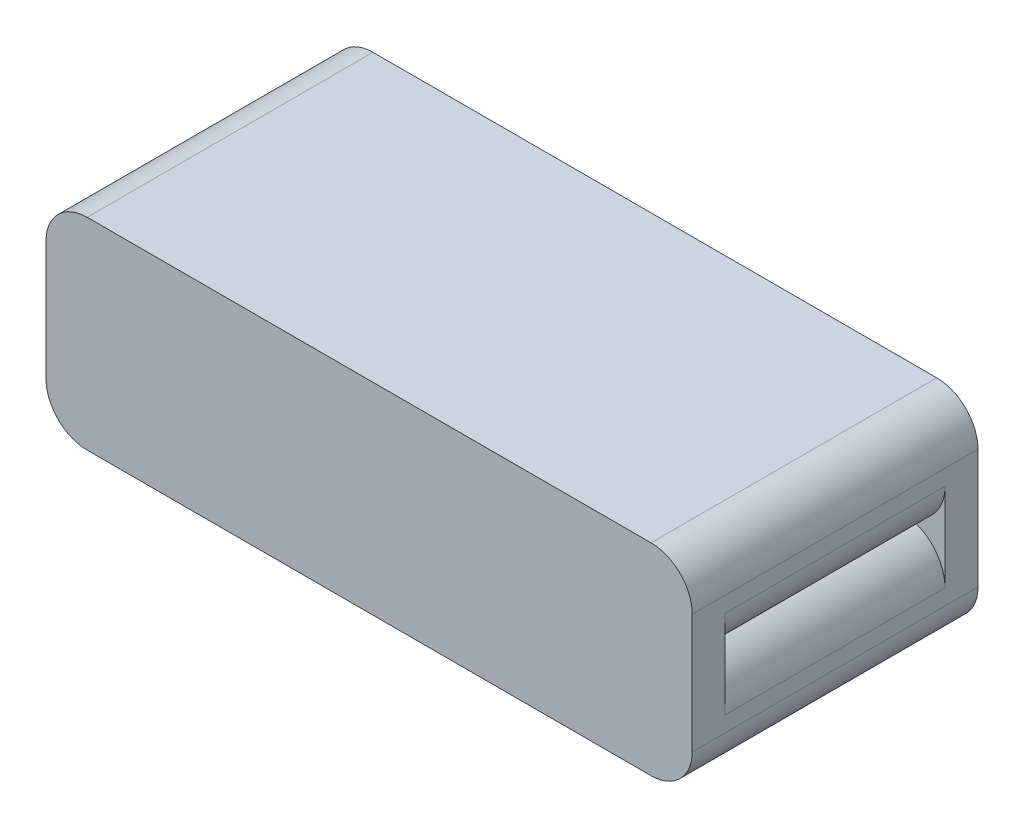
ISO-10303-21;
HEADER;
FILE_DESCRIPTION(('STEP AP214'),'2;1');
FILE_NAME('part.step','',(''),(''),'','','');
FILE_SCHEMA(('AUTOMOTIVE_DESIGN { 1 0 10303 214 1 1 1 1 }'));
ENDSEC;
DATA;
#1=APPLICATION_CONTEXT('core data for automotive mechanical design processes');
#2=APPLICATION_PROTOCOL_DEFINITION('international standard','automotive_design',2000,#1);
#3=PRODUCT_CONTEXT('',#1,'mechanical');
#4=PRODUCT('Part','Part','',(#3));
#5=PRODUCT_RELATED_PRODUCT_CATEGORY('part','',(#4));
#6=PRODUCT_DEFINITION_FORMATION('','',#4);
#7=PRODUCT_DEFINITION_CONTEXT('part definition',#1,'design');
#8=PRODUCT_DEFINITION('design','',#6,#7);
#9=PRODUCT_DEFINITION_SHAPE('','',#8);
#10=(LENGTH_UNIT() NAMED_UNIT(*) SI_UNIT(.MILLI.,.METRE.));
#11=(NAMED_UNIT(*) PLANE_ANGLE_UNIT() SI_UNIT($,.RADIAN.));
#12=(NAMED_UNIT(*) SI_UNIT($,.STERADIAN.) SOLID_ANGLE_UNIT());
#13=UNCERTAINTY_MEASURE_WITH_UNIT(LENGTH_MEASURE(1.E-05),#10,'distance_accuracy_value','');
#14=(GEOMETRIC_REPRESENTATION_CONTEXT(3) GLOBAL_UNCERTAINTY_ASSIGNED_CONTEXT((#13)) GLOBAL_UNIT_ASSIGNED_CONTEXT((#10,
#11,#12)) REPRESENTATION_CONTEXT('',''));
#15=CARTESIAN_POINT('',(0.,0.,0.));
#16=DIRECTION('',(0.,0.,1.));
#17=DIRECTION('',(1.,0.,0.));
#18=AXIS2_PLACEMENT_3D('',#15,#16,#17);
#19=CARTESIAN_POINT('',(74.676,23.3045,-33.02));
#20=DIRECTION('',(-1.,0.,0.));
#21=DIRECTION('',(0.,0.,1.));
#22=AXIS2_PLACEMENT_3D('',#19,#20,#21);
#23=PLANE('',#22);
#24=DIRECTION('',(0.,-1.,0.));
#25=VECTOR('',#24,1.);
#26=CARTESIAN_POINT('',(74.676,23.3045,-33.02));
#27=LINE('',#26,#25);
#28=CARTESIAN_POINT('',(74.676,13.7795,-33.02));
#29=VERTEX_POINT('',#28);
#30=CARTESIAN_POINT('',(74.676,-13.7795,-33.02));
#31=VERTEX_POINT('',#30);
#32=EDGE_CURVE('E201',#29,#31,#27,.T.);
#33=ORIENTED_EDGE('',*,*,#32,.F.);
#34=DIRECTION('',(0.,0.,-1.));
#35=VECTOR('',#34,1.);
#36=CARTESIAN_POINT('',(74.676,13.7795,33.02));
#37=LINE('',#36,#35);
#38=CARTESIAN_POINT('',(74.676,13.7795,33.02));
#39=VERTEX_POINT('',#38);
#40=EDGE_CURVE('E11',#29,#39,#37,.F.);
#41=ORIENTED_EDGE('',*,*,#40,.T.);
#42=DIRECTION('',(0.,-1.,0.));
#43=VECTOR('',#42,1.);
#44=CARTESIAN_POINT('',(74.676,23.3045,33.02));
#45=LINE('',#44,#43);
#46=CARTESIAN_POINT('',(74.676,-13.7795,33.02));
#47=VERTEX_POINT('',#46);
#48=EDGE_CURVE('E204',#39,#47,#45,.T.);
#49=ORIENTED_EDGE('',*,*,#48,.T.);
#50=DIRECTION('',(0.,0.,-1.));
#51=VECTOR('',#50,1.);
#52=CARTESIAN_POINT('',(74.676,-13.7795,-33.02));
#53=LINE('',#52,#51);
#54=EDGE_CURVE('E40',#47,#31,#53,.T.);
#55=ORIENTED_EDGE('',*,*,#54,.T.);
#56=EDGE_LOOP('',(#33,#41,#49,#55));
#57=FACE_BOUND('',#56,.T.);
#58=DIRECTION('',(0.,-1.,0.));
#59=VECTOR('',#58,1.);
#60=CARTESIAN_POINT('',(74.676,10.16,-25.4));
#61=LINE('',#60,#59);
#62=CARTESIAN_POINT('',(74.676,10.16,-25.4));
#63=VERTEX_POINT('',#62);
#64=CARTESIAN_POINT('',(74.676,-10.16,-25.4));
#65=VERTEX_POINT('',#64);
#66=EDGE_CURVE('E151',#63,#65,#61,.T.);
#67=ORIENTED_EDGE('',*,*,#66,.T.);
#68=DIRECTION('',(0.,0.,1.));
#69=VECTOR('',#68,1.);
#70=CARTESIAN_POINT('',(74.676,-10.16,-25.4));
#71=LINE('',#70,#69);
#72=CARTESIAN_POINT('',(74.676,-10.16,25.4));
#73=VERTEX_POINT('',#72);
#74=EDGE_CURVE('E135',#65,#73,#71,.T.);
#75=ORIENTED_EDGE('',*,*,#74,.T.);
#76=DIRECTION('',(0.,-1.,0.));
#77=VECTOR('',#76,1.);
#78=CARTESIAN_POINT('',(74.676,10.16,25.4));
#79=LINE('',#78,#77);
#80=CARTESIAN_POINT('',(74.676,10.16,25.4));
#81=VERTEX_POINT('',#80);
#82=EDGE_CURVE('E158',#81,#73,#79,.T.);
#83=ORIENTED_EDGE('',*,*,#82,.F.);
#84=DIRECTION('',(0.,0.,1.));
#85=VECTOR('',#84,1.);
#86=CARTESIAN_POINT('',(74.676,10.16,-25.4));
#87=LINE('',#86,#85);
#88=EDGE_CURVE('E47',#63,#81,#87,.T.);
#89=ORIENTED_EDGE('',*,*,#88,.F.);
#90=EDGE_LOOP('',(#67,#75,#83,#89));
#91=FACE_BOUND('',#90,.T.);
#92=ADVANCED_FACE('F32',(#57,#91),#23,.F.);
#93=CARTESIAN_POINT('',(-74.676,23.3045,-33.02));
#94=DIRECTION('',(1.,0.,0.));
#95=DIRECTION('',(0.,0.,-1.));
#96=AXIS2_PLACEMENT_3D('',#93,#94,#95);
#97=PLANE('',#96);
#98=DIRECTION('',(0.,-1.,0.));
#99=VECTOR('',#98,1.);
#100=CARTESIAN_POINT('',(-74.676,23.3045,-33.02));
#101=LINE('',#100,#99);
#102=CARTESIAN_POINT('',(-74.676,13.7795,-33.02));
#103=VERTEX_POINT('',#102);
#104=CARTESIAN_POINT('',(-74.676,-13.7795,-33.02));
#105=VERTEX_POINT('',#104);
#106=EDGE_CURVE('E194',#103,#105,#101,.T.);
#107=ORIENTED_EDGE('',*,*,#106,.T.);
#108=DIRECTION('',(0.,0.,1.));
#109=VECTOR('',#108,1.);
#110=CARTESIAN_POINT('',(-74.676,-13.7795,-33.02));
#111=LINE('',#110,#109);
#112=CARTESIAN_POINT('',(-74.676,-13.7795,33.02));
#113=VERTEX_POINT('',#112);
#114=EDGE_CURVE('E212',#105,#113,#111,.T.);
#115=ORIENTED_EDGE('',*,*,#114,.T.);
#116=DIRECTION('',(0.,-1.,0.));
#117=VECTOR('',#116,1.);
#118=CARTESIAN_POINT('',(-74.676,23.3045,33.02));
#119=LINE('',#118,#117);
#120=CARTESIAN_POINT('',(-74.676,13.7795,33.02));
#121=VERTEX_POINT('',#120);
#122=EDGE_CURVE('E207',#121,#113,#119,.T.);
#123=ORIENTED_EDGE('',*,*,#122,.F.);
#124=DIRECTION('',(0.,0.,1.));
#125=VECTOR('',#124,1.);
#126=CARTESIAN_POINT('',(-74.676,13.7795,-33.02));
#127=LINE('',#126,#125);
#128=EDGE_CURVE('E210',#121,#103,#127,.F.);
#129=ORIENTED_EDGE('',*,*,#128,.T.);
#130=EDGE_LOOP('',(#107,#115,#123,#129));
#131=FACE_BOUND('',#130,.T.);
#132=DIRECTION('',(0.,-1.,0.));
#133=VECTOR('',#132,1.);
#134=CARTESIAN_POINT('',(-74.676,10.16,-25.4));
#135=LINE('',#134,#133);
#136=CARTESIAN_POINT('',(-74.676,10.16,-25.4));
#137=VERTEX_POINT('',#136);
#138=CARTESIAN_POINT('',(-74.676,-10.16,-25.4));
#139=VERTEX_POINT('',#138);
#140=EDGE_CURVE('E171',#137,#139,#135,.T.);
#141=ORIENTED_EDGE('',*,*,#140,.F.);
#142=DIRECTION('',(0.,0.,1.));
#143=VECTOR('',#142,1.);
#144=CARTESIAN_POINT('',(-74.676,10.16,-25.4));
#145=LINE('',#144,#143);
#146=CARTESIAN_POINT('',(-74.676,10.16,25.4));
#147=VERTEX_POINT('',#146);
#148=EDGE_CURVE('E183',#137,#147,#145,.T.);
#149=ORIENTED_EDGE('',*,*,#148,.T.);
#150=DIRECTION('',(0.,-1.,0.));
#151=VECTOR('',#150,1.);
#152=CARTESIAN_POINT('',(-74.676,10.16,25.4));
#153=LINE('',#152,#151);
#154=CARTESIAN_POINT('',(-74.676,-10.16,25.4));
#155=VERTEX_POINT('',#154);
#156=EDGE_CURVE('E168',#147,#155,#153,.T.);
#157=ORIENTED_EDGE('',*,*,#156,.T.);
#158=DIRECTION('',(0.,0.,1.));
#159=VECTOR('',#158,1.);
#160=CARTESIAN_POINT('',(-74.676,-10.16,-25.4));
#161=LINE('',#160,#159);
#162=EDGE_CURVE('E180',#139,#155,#161,.T.);
#163=ORIENTED_EDGE('',*,*,#162,.F.);
#164=EDGE_LOOP('',(#141,#149,#157,#163));
#165=FACE_BOUND('',#164,.T.);
#166=ADVANCED_FACE('F274',(#131,#165),#97,.F.);
#167=CARTESIAN_POINT('',(-74.676,23.3045,33.02));
#168=DIRECTION('',(0.,0.,-1.));
#169=DIRECTION('',(-1.,0.,0.));
#170=AXIS2_PLACEMENT_3D('',#167,#168,#169);
#171=PLANE('',#170);
#172=ORIENTED_EDGE('',*,*,#122,.T.);
#173=CARTESIAN_POINT('',(-65.151,-13.7795,33.02));
#174=DIRECTION('',(0.,0.,-1.));
#175=DIRECTION('',(-1.,0.,0.));
#176=AXIS2_PLACEMENT_3D('',#173,#174,#175);
#177=CIRCLE('',#176,9.525);
#178=CARTESIAN_POINT('',(-65.151,-23.3045,33.02));
#179=VERTEX_POINT('',#178);
#180=EDGE_CURVE('E221',#113,#179,#177,.F.);
#181=ORIENTED_EDGE('',*,*,#180,.T.);
#182=DIRECTION('',(1.,0.,0.));
#183=VECTOR('',#182,1.);
#184=CARTESIAN_POINT('',(-74.676,-23.3045,33.02));
#185=LINE('',#184,#183);
#186=CARTESIAN_POINT('',(65.151,-23.3045,33.02));
#187=VERTEX_POINT('',#186);
#188=EDGE_CURVE('E182',#179,#187,#185,.T.);
#189=ORIENTED_EDGE('',*,*,#188,.T.);
#190=CARTESIAN_POINT('',(65.151,-13.7795,33.02));
#191=DIRECTION('',(0.,0.,-1.));
#192=DIRECTION('',(-1.,0.,0.));
#193=AXIS2_PLACEMENT_3D('',#190,#191,#192);
#194=CIRCLE('',#193,9.525);
#195=EDGE_CURVE('E215',#187,#47,#194,.F.);
#196=ORIENTED_EDGE('',*,*,#195,.T.);
#197=ORIENTED_EDGE('',*,*,#48,.F.);
#198=CARTESIAN_POINT('',(65.151,13.7795,33.02));
#199=DIRECTION('',(0.,0.,-1.));
#200=DIRECTION('',(-1.,0.,0.));
#201=AXIS2_PLACEMENT_3D('',#198,#199,#200);
#202=CIRCLE('',#201,9.525);
#203=CARTESIAN_POINT('',(65.151,23.3045,33.02));
#204=VERTEX_POINT('',#203);
#205=EDGE_CURVE('E217',#39,#204,#202,.F.);
#206=ORIENTED_EDGE('',*,*,#205,.T.);
#207=DIRECTION('',(1.,0.,0.));
#208=VECTOR('',#207,1.);
#209=CARTESIAN_POINT('',(-74.676,23.3045,33.02));
#210=LINE('',#209,#208);
#211=CARTESIAN_POINT('',(-65.151,23.3045,33.02));
#212=VERTEX_POINT('',#211);
#213=EDGE_CURVE('E187',#212,#204,#210,.T.);
#214=ORIENTED_EDGE('',*,*,#213,.F.);
#215=CARTESIAN_POINT('',(-65.151,13.7795,33.02));
#216=DIRECTION('',(0.,0.,-1.));
#217=DIRECTION('',(-1.,0.,0.));
#218=AXIS2_PLACEMENT_3D('',#215,#216,#217);
#219=CIRCLE('',#218,9.525);
#220=EDGE_CURVE('E219',#212,#121,#219,.F.);
#221=ORIENTED_EDGE('',*,*,#220,.T.);
#222=EDGE_LOOP('',(#172,#181,#189,#196,#197,#206,#214,#221));
#223=FACE_BOUND('',#222,.T.);
#224=ADVANCED_FACE('F261',(#223),#171,.F.);
#225=CARTESIAN_POINT('',(-74.676,23.3045,-33.02));
#226=DIRECTION('',(0.,0.,1.));
#227=DIRECTION('',(1.,0.,0.));
#228=AXIS2_PLACEMENT_3D('',#225,#226,#227);
#229=PLANE('',#228);
#230=DIRECTION('',(-1.,0.,0.));
#231=VECTOR('',#230,1.);
#232=CARTESIAN_POINT('',(-74.676,-23.3045,-33.02));
#233=LINE('',#232,#231);
#234=CARTESIAN_POINT('',(65.151,-23.3045,-33.02));
#235=VERTEX_POINT('',#234);
#236=CARTESIAN_POINT('',(-65.151,-23.3045,-33.02));
#237=VERTEX_POINT('',#236);
#238=EDGE_CURVE('E191',#235,#237,#233,.T.);
#239=ORIENTED_EDGE('',*,*,#238,.T.);
#240=CARTESIAN_POINT('',(-65.151,-13.7795,-33.02));
#241=DIRECTION('',(0.,0.,1.));
#242=DIRECTION('',(1.,0.,0.));
#243=AXIS2_PLACEMENT_3D('',#240,#241,#242);
#244=CIRCLE('',#243,9.525);
#245=EDGE_CURVE('E233',#237,#105,#244,.F.);
#246=ORIENTED_EDGE('',*,*,#245,.T.);
#247=ORIENTED_EDGE('',*,*,#106,.F.);
#248=CARTESIAN_POINT('',(-65.151,13.7795,-33.02));
#249=DIRECTION('',(0.,0.,1.));
#250=DIRECTION('',(1.,0.,0.));
#251=AXIS2_PLACEMENT_3D('',#248,#249,#250);
#252=CIRCLE('',#251,9.525);
#253=CARTESIAN_POINT('',(-65.151,23.3045,-33.02));
#254=VERTEX_POINT('',#253);
#255=EDGE_CURVE('E231',#103,#254,#252,.F.);
#256=ORIENTED_EDGE('',*,*,#255,.T.);
#257=DIRECTION('',(-1.,0.,0.));
#258=VECTOR('',#257,1.);
#259=CARTESIAN_POINT('',(-74.676,23.3045,-33.02));
#260=LINE('',#259,#258);
#261=CARTESIAN_POINT('',(65.151,23.3045,-33.02));
#262=VERTEX_POINT('',#261);
#263=EDGE_CURVE('E190',#262,#254,#260,.T.);
#264=ORIENTED_EDGE('',*,*,#263,.F.);
#265=CARTESIAN_POINT('',(65.151,13.7795,-33.02));
#266=DIRECTION('',(0.,0.,1.));
#267=DIRECTION('',(1.,0.,0.));
#268=AXIS2_PLACEMENT_3D('',#265,#266,#267);
#269=CIRCLE('',#268,9.525);
#270=EDGE_CURVE('E229',#262,#29,#269,.F.);
#271=ORIENTED_EDGE('',*,*,#270,.T.);
#272=ORIENTED_EDGE('',*,*,#32,.T.);
#273=CARTESIAN_POINT('',(65.151,-13.7795,-33.02));
#274=DIRECTION('',(0.,0.,1.));
#275=DIRECTION('',(1.,0.,0.));
#276=AXIS2_PLACEMENT_3D('',#273,#274,#275);
#277=CIRCLE('',#276,9.525);
#278=EDGE_CURVE('E227',#31,#235,#277,.F.);
#279=ORIENTED_EDGE('',*,*,#278,.T.);
#280=EDGE_LOOP('',(#239,#246,#247,#256,#264,#271,#272,#279));
#281=FACE_BOUND('',#280,.T.);
#282=ADVANCED_FACE('F249',(#281),#229,.F.);
#283=CARTESIAN_POINT('',(0.,23.3045,0.));
#284=DIRECTION('',(0.,1.,0.));
#285=DIRECTION('',(0.,0.,1.));
#286=AXIS2_PLACEMENT_3D('',#283,#284,#285);
#287=PLANE('',#286);
#288=ORIENTED_EDGE('',*,*,#263,.T.);
#289=DIRECTION('',(0.,0.,1.));
#290=VECTOR('',#289,1.);
#291=CARTESIAN_POINT('',(-65.151,23.3045,33.02));
#292=LINE('',#291,#290);
#293=EDGE_CURVE('E238',#254,#212,#292,.T.);
#294=ORIENTED_EDGE('',*,*,#293,.T.);
#295=ORIENTED_EDGE('',*,*,#213,.T.);
#296=DIRECTION('',(0.,0.,-1.));
#297=VECTOR('',#296,1.);
#298=CARTESIAN_POINT('',(65.151,23.3045,-33.02));
#299=LINE('',#298,#297);
#300=EDGE_CURVE('E235',#204,#262,#299,.T.);
#301=ORIENTED_EDGE('',*,*,#300,.T.);
#302=EDGE_LOOP('',(#288,#294,#295,#301));
#303=FACE_BOUND('',#302,.T.);
#304=ADVANCED_FACE('F257',(#303),#287,.T.);
#305=CARTESIAN_POINT('',(0.,-23.3045,0.));
#306=DIRECTION('',(0.,1.,0.));
#307=DIRECTION('',(0.,0.,1.));
#308=AXIS2_PLACEMENT_3D('',#305,#306,#307);
#309=PLANE('',#308);
#310=ORIENTED_EDGE('',*,*,#188,.F.);
#311=DIRECTION('',(0.,0.,1.));
#312=VECTOR('',#311,1.);
#313=CARTESIAN_POINT('',(-65.151,-23.3045,0.));
#314=LINE('',#313,#312);
#315=EDGE_CURVE('E225',#179,#237,#314,.F.);
#316=ORIENTED_EDGE('',*,*,#315,.T.);
#317=ORIENTED_EDGE('',*,*,#238,.F.);
#318=DIRECTION('',(0.,0.,-1.));
#319=VECTOR('',#318,1.);
#320=CARTESIAN_POINT('',(65.151,-23.3045,0.));
#321=LINE('',#320,#319);
#322=EDGE_CURVE('E223',#235,#187,#321,.F.);
#323=ORIENTED_EDGE('',*,*,#322,.T.);
#324=EDGE_LOOP('',(#310,#316,#317,#323));
#325=FACE_BOUND('',#324,.T.);
#326=ADVANCED_FACE('F266',(#325),#309,.F.);
#327=CARTESIAN_POINT('',(-65.151,-13.7795,-33.02));
#328=DIRECTION('',(0.,0.,1.));
#329=DIRECTION('',(1.,0.,0.));
#330=AXIS2_PLACEMENT_3D('',#327,#328,#329);
#331=CYLINDRICAL_SURFACE('',#330,9.525);
#332=ORIENTED_EDGE('',*,*,#245,.F.);
#333=ORIENTED_EDGE('',*,*,#315,.F.);
#334=ORIENTED_EDGE('',*,*,#180,.F.);
#335=ORIENTED_EDGE('',*,*,#114,.F.);
#336=EDGE_LOOP('',(#332,#333,#334,#335));
#337=FACE_BOUND('',#336,.T.);
#338=ADVANCED_FACE('F272',(#337),#331,.T.);
#339=CARTESIAN_POINT('',(-65.151,13.7795,0.));
#340=DIRECTION('',(0.,0.,-1.));
#341=DIRECTION('',(-1.,0.,0.));
#342=AXIS2_PLACEMENT_3D('',#339,#340,#341);
#343=CYLINDRICAL_SURFACE('',#342,9.525);
#344=ORIENTED_EDGE('',*,*,#255,.F.);
#345=ORIENTED_EDGE('',*,*,#128,.F.);
#346=ORIENTED_EDGE('',*,*,#220,.F.);
#347=ORIENTED_EDGE('',*,*,#293,.F.);
#348=EDGE_LOOP('',(#344,#345,#346,#347));
#349=FACE_BOUND('',#348,.T.);
#350=ADVANCED_FACE('F279',(#349),#343,.T.);
#351=CARTESIAN_POINT('',(65.151,13.7795,0.));
#352=DIRECTION('',(0.,0.,1.));
#353=DIRECTION('',(1.,0.,0.));
#354=AXIS2_PLACEMENT_3D('',#351,#352,#353);
#355=CYLINDRICAL_SURFACE('',#354,9.525);
#356=ORIENTED_EDGE('',*,*,#205,.F.);
#357=ORIENTED_EDGE('',*,*,#40,.F.);
#358=ORIENTED_EDGE('',*,*,#270,.F.);
#359=ORIENTED_EDGE('',*,*,#300,.F.);
#360=EDGE_LOOP('',(#356,#357,#358,#359));
#361=FACE_BOUND('',#360,.T.);
#362=ADVANCED_FACE('F255',(#361),#355,.T.);
#363=CARTESIAN_POINT('',(65.151,-13.7795,-33.02));
#364=DIRECTION('',(0.,0.,-1.));
#365=DIRECTION('',(-1.,0.,0.));
#366=AXIS2_PLACEMENT_3D('',#363,#364,#365);
#367=CYLINDRICAL_SURFACE('',#366,9.525);
#368=ORIENTED_EDGE('',*,*,#195,.F.);
#369=ORIENTED_EDGE('',*,*,#322,.F.);
#370=ORIENTED_EDGE('',*,*,#278,.F.);
#371=ORIENTED_EDGE('',*,*,#54,.F.);
#372=EDGE_LOOP('',(#368,#369,#370,#371));
#373=FACE_BOUND('',#372,.T.);
#374=ADVANCED_FACE('F34',(#373),#367,.T.);
#375=CARTESIAN_POINT('',(-64.516,-10.16,-25.4));
#376=DIRECTION('',(0.,0.,1.));
#377=DIRECTION('',(1.,0.,0.));
#378=AXIS2_PLACEMENT_3D('',#375,#376,#377);
#379=CYLINDRICAL_SURFACE('',#378,10.16);
#380=CARTESIAN_POINT('',(-64.516,-10.16,25.4));
#381=DIRECTION('',(0.,0.,-1.));
#382=DIRECTION('',(1.,0.,0.));
#383=AXIS2_PLACEMENT_3D('',#380,#381,#382);
#384=CIRCLE('',#383,10.16);
#385=CARTESIAN_POINT('',(-64.516,0.,25.4));
#386=VERTEX_POINT('',#385);
#387=EDGE_CURVE('E55',#155,#386,#384,.T.);
#388=ORIENTED_EDGE('',*,*,#387,.T.);
#389=DIRECTION('',(0.,0.,1.));
#390=VECTOR('',#389,1.);
#391=CARTESIAN_POINT('',(-64.516,0.,-25.4));
#392=LINE('',#391,#390);
#393=CARTESIAN_POINT('',(-64.516,0.,-25.4));
#394=VERTEX_POINT('',#393);
#395=EDGE_CURVE('E174',#394,#386,#392,.T.);
#396=ORIENTED_EDGE('',*,*,#395,.F.);
#397=CARTESIAN_POINT('',(-64.516,-10.16,-25.4));
#398=DIRECTION('',(0.,0.,-1.));
#399=DIRECTION('',(1.,0.,0.));
#400=AXIS2_PLACEMENT_3D('',#397,#398,#399);
#401=CIRCLE('',#400,10.16);
#402=EDGE_CURVE('E164',#139,#394,#401,.T.);
#403=ORIENTED_EDGE('',*,*,#402,.F.);
#404=ORIENTED_EDGE('',*,*,#162,.T.);
#405=EDGE_LOOP('',(#388,#396,#403,#404));
#406=FACE_BOUND('',#405,.T.);
#407=ADVANCED_FACE('F308',(#406),#379,.T.);
#408=CARTESIAN_POINT('',(-64.516,10.16,-25.4));
#409=DIRECTION('',(0.,0.,1.));
#410=DIRECTION('',(1.,0.,0.));
#411=AXIS2_PLACEMENT_3D('',#408,#409,#410);
#412=CYLINDRICAL_SURFACE('',#411,10.16);
#413=CARTESIAN_POINT('',(-64.516,10.16,25.4));
#414=DIRECTION('',(0.,0.,-1.));
#415=DIRECTION('',(1.,0.,0.));
#416=AXIS2_PLACEMENT_3D('',#413,#414,#415);
#417=CIRCLE('',#416,10.16);
#418=EDGE_CURVE('E176',#386,#147,#417,.T.);
#419=ORIENTED_EDGE('',*,*,#418,.T.);
#420=ORIENTED_EDGE('',*,*,#148,.F.);
#421=CARTESIAN_POINT('',(-64.516,10.16,-25.4));
#422=DIRECTION('',(0.,0.,-1.));
#423=DIRECTION('',(1.,0.,0.));
#424=AXIS2_PLACEMENT_3D('',#421,#422,#423);
#425=CIRCLE('',#424,10.16);
#426=EDGE_CURVE('E167',#394,#137,#425,.T.);
#427=ORIENTED_EDGE('',*,*,#426,.F.);
#428=ORIENTED_EDGE('',*,*,#395,.T.);
#429=EDGE_LOOP('',(#419,#420,#427,#428));
#430=FACE_BOUND('',#429,.T.);
#431=ADVANCED_FACE('F311',(#430),#412,.T.);
#432=CARTESIAN_POINT('',(-64.516,-10.16,-25.4));
#433=DIRECTION('',(0.,0.,1.));
#434=DIRECTION('',(1.,0.,0.));
#435=AXIS2_PLACEMENT_3D('',#432,#433,#434);
#436=PLANE('',#435);
#437=ORIENTED_EDGE('',*,*,#402,.T.);
#438=ORIENTED_EDGE('',*,*,#426,.T.);
#439=ORIENTED_EDGE('',*,*,#140,.T.);
#440=EDGE_LOOP('',(#437,#438,#439));
#441=FACE_BOUND('',#440,.T.);
#442=ADVANCED_FACE('F315',(#441),#436,.T.);
#443=CARTESIAN_POINT('',(-64.516,-10.16,25.4));
#444=DIRECTION('',(0.,0.,1.));
#445=DIRECTION('',(1.,0.,0.));
#446=AXIS2_PLACEMENT_3D('',#443,#444,#445);
#447=PLANE('',#446);
#448=ORIENTED_EDGE('',*,*,#387,.F.);
#449=ORIENTED_EDGE('',*,*,#156,.F.);
#450=ORIENTED_EDGE('',*,*,#418,.F.);
#451=EDGE_LOOP('',(#448,#449,#450));
#452=FACE_BOUND('',#451,.T.);
#453=ADVANCED_FACE('F317',(#452),#447,.F.);
#454=CARTESIAN_POINT('',(64.516,-10.16,-25.4));
#455=DIRECTION('',(0.,0.,1.));
#456=DIRECTION('',(1.,0.,0.));
#457=AXIS2_PLACEMENT_3D('',#454,#455,#456);
#458=CYLINDRICAL_SURFACE('',#457,10.16);
#459=CARTESIAN_POINT('',(64.516,-10.16,25.4));
#460=DIRECTION('',(0.,0.,1.));
#461=DIRECTION('',(-1.,0.,0.));
#462=AXIS2_PLACEMENT_3D('',#459,#460,#461);
#463=CIRCLE('',#462,10.16);
#464=CARTESIAN_POINT('',(64.516,0.,25.4));
#465=VERTEX_POINT('',#464);
#466=EDGE_CURVE('E142',#73,#465,#463,.T.);
#467=ORIENTED_EDGE('',*,*,#466,.F.);
#468=ORIENTED_EDGE('',*,*,#74,.F.);
#469=CARTESIAN_POINT('',(64.516,-10.16,-25.4));
#470=DIRECTION('',(0.,0.,1.));
#471=DIRECTION('',(-1.,0.,0.));
#472=AXIS2_PLACEMENT_3D('',#469,#470,#471);
#473=CIRCLE('',#472,10.16);
#474=CARTESIAN_POINT('',(64.516,0.,-25.4));
#475=VERTEX_POINT('',#474);
#476=EDGE_CURVE('E139',#65,#475,#473,.T.);
#477=ORIENTED_EDGE('',*,*,#476,.T.);
#478=DIRECTION('',(0.,0.,1.));
#479=VECTOR('',#478,1.);
#480=CARTESIAN_POINT('',(64.516,0.,-25.4));
#481=LINE('',#480,#479);
#482=EDGE_CURVE('E161',#475,#465,#481,.T.);
#483=ORIENTED_EDGE('',*,*,#482,.T.);
#484=EDGE_LOOP('',(#467,#468,#477,#483));
#485=FACE_BOUND('',#484,.T.);
#486=ADVANCED_FACE('F137',(#485),#458,.T.);
#487=CARTESIAN_POINT('',(64.516,10.16,-25.4));
#488=DIRECTION('',(0.,0.,1.));
#489=DIRECTION('',(1.,0.,0.));
#490=AXIS2_PLACEMENT_3D('',#487,#488,#489);
#491=CYLINDRICAL_SURFACE('',#490,10.16);
#492=CARTESIAN_POINT('',(64.516,10.16,25.4));
#493=DIRECTION('',(0.,0.,1.));
#494=DIRECTION('',(-1.,0.,0.));
#495=AXIS2_PLACEMENT_3D('',#492,#493,#494);
#496=CIRCLE('',#495,10.16);
#497=EDGE_CURVE('E152',#465,#81,#496,.T.);
#498=ORIENTED_EDGE('',*,*,#497,.F.);
#499=ORIENTED_EDGE('',*,*,#482,.F.);
#500=CARTESIAN_POINT('',(64.516,10.16,-25.4));
#501=DIRECTION('',(0.,0.,1.));
#502=DIRECTION('',(-1.,0.,0.));
#503=AXIS2_PLACEMENT_3D('',#500,#501,#502);
#504=CIRCLE('',#503,10.16);
#505=EDGE_CURVE('E146',#475,#63,#504,.T.);
#506=ORIENTED_EDGE('',*,*,#505,.T.);
#507=ORIENTED_EDGE('',*,*,#88,.T.);
#508=EDGE_LOOP('',(#498,#499,#506,#507));
#509=FACE_BOUND('',#508,.T.);
#510=ADVANCED_FACE('F325',(#509),#491,.T.);
#511=CARTESIAN_POINT('',(64.516,-10.16,-25.4));
#512=DIRECTION('',(0.,0.,1.));
#513=DIRECTION('',(-1.,0.,0.));
#514=AXIS2_PLACEMENT_3D('',#511,#512,#513);
#515=PLANE('',#514);
#516=ORIENTED_EDGE('',*,*,#476,.F.);
#517=ORIENTED_EDGE('',*,*,#66,.F.);
#518=ORIENTED_EDGE('',*,*,#505,.F.);
#519=EDGE_LOOP('',(#516,#517,#518));
#520=FACE_BOUND('',#519,.T.);
#521=ADVANCED_FACE('F150',(#520),#515,.T.);
#522=CARTESIAN_POINT('',(64.516,-10.16,25.4));
#523=DIRECTION('',(0.,0.,1.));
#524=DIRECTION('',(-1.,0.,0.));
#525=AXIS2_PLACEMENT_3D('',#522,#523,#524);
#526=PLANE('',#525);
#527=ORIENTED_EDGE('',*,*,#466,.T.);
#528=ORIENTED_EDGE('',*,*,#497,.T.);
#529=ORIENTED_EDGE('',*,*,#82,.T.);
#530=EDGE_LOOP('',(#527,#528,#529));
#531=FACE_BOUND('',#530,.T.);
#532=ADVANCED_FACE('F328',(#531),#526,.F.);
#533=CLOSED_SHELL('',(#92,#166,#224,#282,#304,#326,#338,#350,#362,#374,#407,#431,#442,#453,#486,
#510,#521,#532));
#534=MANIFOLD_SOLID_BREP('B2',#533);
#535=ADVANCED_BREP_SHAPE_REPRESENTATION('',(#18,#534),#14);
#536=SHAPE_DEFINITION_REPRESENTATION(#9,#535);
ENDSEC;
END-ISO-10303-21;
